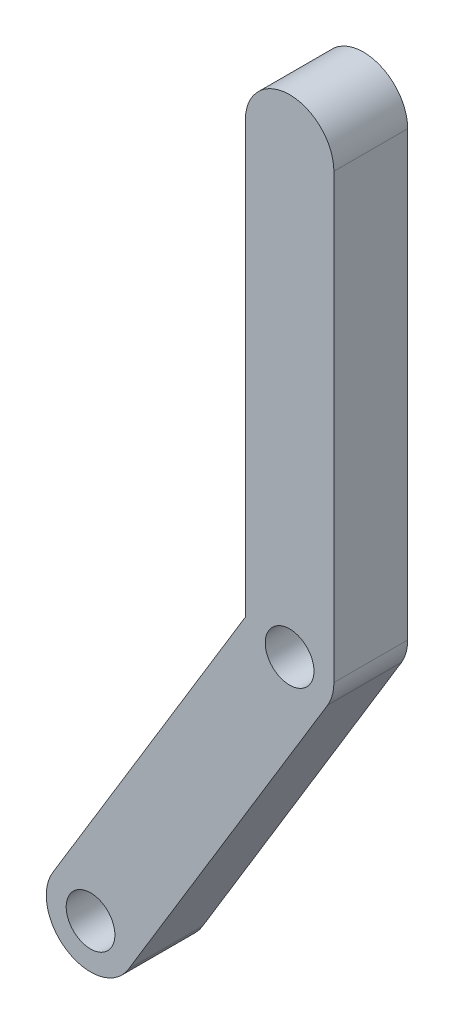
ISO-10303-21;
HEADER;
FILE_DESCRIPTION(('STEP AP214'),'2;1');
FILE_NAME('part.step','',(''),(''),'','','');
FILE_SCHEMA(('AUTOMOTIVE_DESIGN { 1 0 10303 214 1 1 1 1 }'));
ENDSEC;
DATA;
#1=APPLICATION_CONTEXT('core data for automotive mechanical design processes');
#2=APPLICATION_PROTOCOL_DEFINITION('international standard','automotive_design',2000,#1);
#3=PRODUCT_CONTEXT('',#1,'mechanical');
#4=PRODUCT('Part','Part','',(#3));
#5=PRODUCT_RELATED_PRODUCT_CATEGORY('part','',(#4));
#6=PRODUCT_DEFINITION_FORMATION('','',#4);
#7=PRODUCT_DEFINITION_CONTEXT('part definition',#1,'design');
#8=PRODUCT_DEFINITION('design','',#6,#7);
#9=PRODUCT_DEFINITION_SHAPE('','',#8);
#10=(LENGTH_UNIT() NAMED_UNIT(*) SI_UNIT(.MILLI.,.METRE.));
#11=(NAMED_UNIT(*) PLANE_ANGLE_UNIT() SI_UNIT($,.RADIAN.));
#12=(NAMED_UNIT(*) SI_UNIT($,.STERADIAN.) SOLID_ANGLE_UNIT());
#13=UNCERTAINTY_MEASURE_WITH_UNIT(LENGTH_MEASURE(1.E-05),#10,'distance_accuracy_value','');
#14=(GEOMETRIC_REPRESENTATION_CONTEXT(3) GLOBAL_UNCERTAINTY_ASSIGNED_CONTEXT((#13)) GLOBAL_UNIT_ASSIGNED_CONTEXT((#10,
#11,#12)) REPRESENTATION_CONTEXT('',''));
#15=CARTESIAN_POINT('',(0.,0.,0.));
#16=DIRECTION('',(0.,0.,1.));
#17=DIRECTION('',(1.,0.,0.));
#18=AXIS2_PLACEMENT_3D('',#15,#16,#17);
#19=CARTESIAN_POINT('',(2.56451588489692,-1.55618644079088,5.));
#20=DIRECTION('',(0.854911870672944,-0.518773258160525,0.));
#21=DIRECTION('',(0.518773258160525,0.854911870672944,0.));
#22=AXIS2_PLACEMENT_3D('',#19,#20,#21);
#23=PLANE('',#22);
#24=DIRECTION('',(-0.518773258160525,-0.854911870672944,0.));
#25=VECTOR('',#24,1.);
#26=CARTESIAN_POINT('',(2.56451588489692,-1.55618644079088,0.));
#27=LINE('',#26,#25);
#28=CARTESIAN_POINT('',(2.58488748132457,-1.52261508888212,0.));
#29=VERTEX_POINT('',#28);
#30=CARTESIAN_POINT('',(-10.9032172308491,-23.7503237263787,0.));
#31=VERTEX_POINT('',#30);
#32=EDGE_CURVE('E136',#29,#31,#27,.T.);
#33=ORIENTED_EDGE('',*,*,#32,.F.);
#34=DIRECTION('',(0.,0.,-1.));
#35=VECTOR('',#34,1.);
#36=CARTESIAN_POINT('',(2.58488748132457,-1.52261508888212,5.));
#37=LINE('',#36,#35);
#38=CARTESIAN_POINT('',(2.58488748132457,-1.52261508888212,5.));
#39=VERTEX_POINT('',#38);
#40=EDGE_CURVE('E11',#39,#29,#37,.T.);
#41=ORIENTED_EDGE('',*,*,#40,.F.);
#42=DIRECTION('',(-0.518773258160525,-0.854911870672944,0.));
#43=VECTOR('',#42,1.);
#44=CARTESIAN_POINT('',(2.56451588489692,-1.55618644079088,5.));
#45=LINE('',#44,#43);
#46=CARTESIAN_POINT('',(-10.9032172308491,-23.7503237263787,5.));
#47=VERTEX_POINT('',#46);
#48=EDGE_CURVE('E159',#39,#47,#45,.T.);
#49=ORIENTED_EDGE('',*,*,#48,.T.);
#50=DIRECTION('',(0.,0.,-1.));
#51=VECTOR('',#50,1.);
#52=CARTESIAN_POINT('',(-10.9032172308491,-23.7503237263787,5.));
#53=LINE('',#52,#51);
#54=EDGE_CURVE('E89',#47,#31,#53,.T.);
#55=ORIENTED_EDGE('',*,*,#54,.T.);
#56=EDGE_LOOP('',(#33,#41,#49,#55));
#57=FACE_BOUND('',#56,.T.);
#58=ADVANCED_FACE('F41',(#57),#23,.T.);
#59=CARTESIAN_POINT('',(0.,0.,5.));
#60=DIRECTION('',(0.,0.,-1.));
#61=DIRECTION('',(-1.,0.,0.));
#62=AXIS2_PLACEMENT_3D('',#59,#60,#61);
#63=CYLINDRICAL_SURFACE('',#62,3.);
#64=CARTESIAN_POINT('',(0.,0.,0.));
#65=DIRECTION('',(0.,0.,1.));
#66=DIRECTION('',(1.,0.,0.));
#67=AXIS2_PLACEMENT_3D('',#64,#65,#66);
#68=CIRCLE('',#67,3.);
#69=CARTESIAN_POINT('',(3.,0.,0.));
#70=VERTEX_POINT('',#69);
#71=EDGE_CURVE('E139',#29,#70,#68,.T.);
#72=ORIENTED_EDGE('',*,*,#71,.T.);
#73=DIRECTION('',(0.,0.,-1.));
#74=VECTOR('',#73,1.);
#75=CARTESIAN_POINT('',(3.,0.,5.));
#76=LINE('',#75,#74);
#77=CARTESIAN_POINT('',(3.,0.,5.));
#78=VERTEX_POINT('',#77);
#79=EDGE_CURVE('E49',#78,#70,#76,.T.);
#80=ORIENTED_EDGE('',*,*,#79,.F.);
#81=CARTESIAN_POINT('',(0.,0.,5.));
#82=DIRECTION('',(0.,0.,1.));
#83=DIRECTION('',(1.,0.,0.));
#84=AXIS2_PLACEMENT_3D('',#81,#82,#83);
#85=CIRCLE('',#84,3.);
#86=EDGE_CURVE('E179',#39,#78,#85,.T.);
#87=ORIENTED_EDGE('',*,*,#86,.F.);
#88=ORIENTED_EDGE('',*,*,#40,.T.);
#89=EDGE_LOOP('',(#72,#80,#87,#88));
#90=FACE_BOUND('',#89,.T.);
#91=ADVANCED_FACE('F172',(#90),#63,.T.);
#92=CARTESIAN_POINT('',(3.,0.,5.));
#93=DIRECTION('',(1.,0.,0.));
#94=DIRECTION('',(0.,1.,0.));
#95=AXIS2_PLACEMENT_3D('',#92,#93,#94);
#96=PLANE('',#95);
#97=DIRECTION('',(0.,-1.,0.));
#98=VECTOR('',#97,1.);
#99=CARTESIAN_POINT('',(3.,0.,0.));
#100=LINE('',#99,#98);
#101=CARTESIAN_POINT('',(3.,30.,0.));
#102=VERTEX_POINT('',#101);
#103=EDGE_CURVE('E144',#102,#70,#100,.T.);
#104=ORIENTED_EDGE('',*,*,#103,.F.);
#105=DIRECTION('',(0.,0.,-1.));
#106=VECTOR('',#105,1.);
#107=CARTESIAN_POINT('',(3.,30.,5.));
#108=LINE('',#107,#106);
#109=CARTESIAN_POINT('',(3.,30.,5.));
#110=VERTEX_POINT('',#109);
#111=EDGE_CURVE('E163',#110,#102,#108,.T.);
#112=ORIENTED_EDGE('',*,*,#111,.F.);
#113=DIRECTION('',(0.,-1.,0.));
#114=VECTOR('',#113,1.);
#115=CARTESIAN_POINT('',(3.,0.,5.));
#116=LINE('',#115,#114);
#117=EDGE_CURVE('E169',#110,#78,#116,.T.);
#118=ORIENTED_EDGE('',*,*,#117,.T.);
#119=ORIENTED_EDGE('',*,*,#79,.T.);
#120=EDGE_LOOP('',(#104,#112,#118,#119));
#121=FACE_BOUND('',#120,.T.);
#122=ADVANCED_FACE('F168',(#121),#96,.T.);
#123=CARTESIAN_POINT('',(0.,30.,5.));
#124=DIRECTION('',(0.,0.,-1.));
#125=DIRECTION('',(-1.,0.,0.));
#126=AXIS2_PLACEMENT_3D('',#123,#124,#125);
#127=CYLINDRICAL_SURFACE('',#126,3.);
#128=CARTESIAN_POINT('',(0.,30.,0.));
#129=DIRECTION('',(0.,0.,1.));
#130=DIRECTION('',(1.,0.,0.));
#131=AXIS2_PLACEMENT_3D('',#128,#129,#130);
#132=CIRCLE('',#131,3.);
#133=CARTESIAN_POINT('',(-3.,30.,0.));
#134=VERTEX_POINT('',#133);
#135=EDGE_CURVE('E147',#102,#134,#132,.T.);
#136=ORIENTED_EDGE('',*,*,#135,.T.);
#137=DIRECTION('',(0.,0.,-1.));
#138=VECTOR('',#137,1.);
#139=CARTESIAN_POINT('',(-3.,30.,5.));
#140=LINE('',#139,#138);
#141=CARTESIAN_POINT('',(-3.,30.,5.));
#142=VERTEX_POINT('',#141);
#143=EDGE_CURVE('E122',#142,#134,#140,.T.);
#144=ORIENTED_EDGE('',*,*,#143,.F.);
#145=CARTESIAN_POINT('',(0.,30.,5.));
#146=DIRECTION('',(0.,0.,1.));
#147=DIRECTION('',(1.,0.,0.));
#148=AXIS2_PLACEMENT_3D('',#145,#146,#147);
#149=CIRCLE('',#148,3.);
#150=EDGE_CURVE('E113',#110,#142,#149,.T.);
#151=ORIENTED_EDGE('',*,*,#150,.F.);
#152=ORIENTED_EDGE('',*,*,#111,.T.);
#153=EDGE_LOOP('',(#136,#144,#151,#152));
#154=FACE_BOUND('',#153,.T.);
#155=ADVANCED_FACE('F178',(#154),#127,.T.);
#156=CARTESIAN_POINT('',(-3.,0.,5.));
#157=DIRECTION('',(1.,0.,0.));
#158=DIRECTION('',(0.,1.,0.));
#159=AXIS2_PLACEMENT_3D('',#156,#157,#158);
#160=PLANE('',#159);
#161=DIRECTION('',(0.,-1.,0.));
#162=VECTOR('',#161,1.);
#163=CARTESIAN_POINT('',(-3.,0.,0.));
#164=LINE('',#163,#162);
#165=CARTESIAN_POINT('',(-3.,0.838530829915266,0.));
#166=VERTEX_POINT('',#165);
#167=EDGE_CURVE('E121',#134,#166,#164,.T.);
#168=ORIENTED_EDGE('',*,*,#167,.T.);
#169=DIRECTION('',(0.,0.,-1.));
#170=VECTOR('',#169,1.);
#171=CARTESIAN_POINT('',(-3.,0.838530829915266,5.));
#172=LINE('',#171,#170);
#173=CARTESIAN_POINT('',(-3.,0.838530829915266,5.));
#174=VERTEX_POINT('',#173);
#175=EDGE_CURVE('E118',#174,#166,#172,.T.);
#176=ORIENTED_EDGE('',*,*,#175,.F.);
#177=DIRECTION('',(0.,-1.,0.));
#178=VECTOR('',#177,1.);
#179=CARTESIAN_POINT('',(-3.,0.,5.));
#180=LINE('',#179,#178);
#181=EDGE_CURVE('E105',#142,#174,#180,.T.);
#182=ORIENTED_EDGE('',*,*,#181,.F.);
#183=ORIENTED_EDGE('',*,*,#143,.T.);
#184=EDGE_LOOP('',(#168,#176,#182,#183));
#185=FACE_BOUND('',#184,.T.);
#186=ADVANCED_FACE('F119',(#185),#160,.F.);
#187=CARTESIAN_POINT('',(-2.56451588489692,1.55618644079088,5.));
#188=DIRECTION('',(0.854911870672944,-0.518773258160526,0.));
#189=DIRECTION('',(0.518773258160526,0.854911870672944,0.));
#190=AXIS2_PLACEMENT_3D('',#187,#188,#189);
#191=PLANE('',#190);
#192=DIRECTION('',(-0.518773258160526,-0.854911870672944,0.));
#193=VECTOR('',#192,1.);
#194=CARTESIAN_POINT('',(-2.56451588489692,1.55618644079088,0.));
#195=LINE('',#194,#193);
#196=CARTESIAN_POINT('',(-16.0322490006429,-20.6379508447969,0.));
#197=VERTEX_POINT('',#196);
#198=EDGE_CURVE('E82',#166,#197,#195,.T.);
#199=ORIENTED_EDGE('',*,*,#198,.T.);
#200=DIRECTION('',(0.,0.,-1.));
#201=VECTOR('',#200,1.);
#202=CARTESIAN_POINT('',(-16.0322490006429,-20.6379508447969,5.));
#203=LINE('',#202,#201);
#204=CARTESIAN_POINT('',(-16.0322490006429,-20.6379508447969,5.));
#205=VERTEX_POINT('',#204);
#206=EDGE_CURVE('E123',#205,#197,#203,.T.);
#207=ORIENTED_EDGE('',*,*,#206,.F.);
#208=DIRECTION('',(-0.518773258160526,-0.854911870672944,0.));
#209=VECTOR('',#208,1.);
#210=CARTESIAN_POINT('',(-2.56451588489692,1.55618644079088,5.));
#211=LINE('',#210,#209);
#212=EDGE_CURVE('E110',#174,#205,#211,.T.);
#213=ORIENTED_EDGE('',*,*,#212,.F.);
#214=ORIENTED_EDGE('',*,*,#175,.T.);
#215=EDGE_LOOP('',(#199,#207,#213,#214));
#216=FACE_BOUND('',#215,.T.);
#217=ADVANCED_FACE('F125',(#216),#191,.F.);
#218=CARTESIAN_POINT('',(0.,0.,5.));
#219=DIRECTION('',(0.,0.,-1.));
#220=DIRECTION('',(-1.,0.,0.));
#221=AXIS2_PLACEMENT_3D('',#218,#219,#220);
#222=CYLINDRICAL_SURFACE('',#221,1.65);
#223=CARTESIAN_POINT('',(0.,0.,5.));
#224=DIRECTION('',(0.,0.,1.));
#225=DIRECTION('',(1.,0.,0.));
#226=AXIS2_PLACEMENT_3D('',#223,#224,#225);
#227=CIRCLE('',#226,1.65);
#228=CARTESIAN_POINT('',(1.65,0.,5.));
#229=VERTEX_POINT('',#228);
#230=EDGE_CURVE('E127',#229,#229,#227,.T.);
#231=ORIENTED_EDGE('',*,*,#230,.T.);
#232=EDGE_LOOP('',(#231));
#233=FACE_BOUND('',#232,.T.);
#234=CARTESIAN_POINT('',(0.,0.,0.));
#235=DIRECTION('',(0.,0.,1.));
#236=DIRECTION('',(1.,0.,0.));
#237=AXIS2_PLACEMENT_3D('',#234,#235,#236);
#238=CIRCLE('',#237,1.65);
#239=CARTESIAN_POINT('',(1.65,0.,0.));
#240=VERTEX_POINT('',#239);
#241=EDGE_CURVE('E153',#240,#240,#238,.T.);
#242=ORIENTED_EDGE('',*,*,#241,.F.);
#243=EDGE_LOOP('',(#242));
#244=FACE_BOUND('',#243,.T.);
#245=ADVANCED_FACE('F200',(#233,#244),#222,.F.);
#246=CARTESIAN_POINT('',(-13.4881047121737,-22.2277086374965,5.));
#247=DIRECTION('',(0.,0.,-1.));
#248=DIRECTION('',(-1.,0.,0.));
#249=AXIS2_PLACEMENT_3D('',#246,#247,#248);
#250=CYLINDRICAL_SURFACE('',#249,3.);
#251=CARTESIAN_POINT('',(-13.4881047121737,-22.2277086374965,0.));
#252=DIRECTION('',(0.,0.,1.));
#253=DIRECTION('',(1.,0.,0.));
#254=AXIS2_PLACEMENT_3D('',#251,#252,#253);
#255=CIRCLE('',#254,3.);
#256=EDGE_CURVE('E151',#197,#31,#255,.T.);
#257=ORIENTED_EDGE('',*,*,#256,.T.);
#258=ORIENTED_EDGE('',*,*,#54,.F.);
#259=CARTESIAN_POINT('',(-13.4881047121737,-22.2277086374965,5.));
#260=DIRECTION('',(0.,0.,1.));
#261=DIRECTION('',(1.,0.,0.));
#262=AXIS2_PLACEMENT_3D('',#259,#260,#261);
#263=CIRCLE('',#262,3.);
#264=EDGE_CURVE('E57',#205,#47,#263,.T.);
#265=ORIENTED_EDGE('',*,*,#264,.F.);
#266=ORIENTED_EDGE('',*,*,#206,.T.);
#267=EDGE_LOOP('',(#257,#258,#265,#266));
#268=FACE_BOUND('',#267,.T.);
#269=ADVANCED_FACE('F201',(#268),#250,.T.);
#270=CARTESIAN_POINT('',(-13.4881047121737,-22.2277086374965,5.));
#271=DIRECTION('',(0.,0.,-1.));
#272=DIRECTION('',(-1.,0.,0.));
#273=AXIS2_PLACEMENT_3D('',#270,#271,#272);
#274=CYLINDRICAL_SURFACE('',#273,1.65);
#275=CARTESIAN_POINT('',(-13.4881047121737,-22.2277086374965,5.));
#276=DIRECTION('',(0.,0.,1.));
#277=DIRECTION('',(1.,0.,0.));
#278=AXIS2_PLACEMENT_3D('',#275,#276,#277);
#279=CIRCLE('',#278,1.65);
#280=CARTESIAN_POINT('',(-11.8381047121737,-22.2277086374965,5.));
#281=VERTEX_POINT('',#280);
#282=EDGE_CURVE('E133',#281,#281,#279,.T.);
#283=ORIENTED_EDGE('',*,*,#282,.T.);
#284=EDGE_LOOP('',(#283));
#285=FACE_BOUND('',#284,.T.);
#286=CARTESIAN_POINT('',(-13.4881047121737,-22.2277086374965,0.));
#287=DIRECTION('',(0.,0.,1.));
#288=DIRECTION('',(1.,0.,0.));
#289=AXIS2_PLACEMENT_3D('',#286,#287,#288);
#290=CIRCLE('',#289,1.65);
#291=CARTESIAN_POINT('',(-11.8381047121737,-22.2277086374965,0.));
#292=VERTEX_POINT('',#291);
#293=EDGE_CURVE('E156',#292,#292,#290,.T.);
#294=ORIENTED_EDGE('',*,*,#293,.F.);
#295=EDGE_LOOP('',(#294));
#296=FACE_BOUND('',#295,.T.);
#297=ADVANCED_FACE('F204',(#285,#296),#274,.F.);
#298=CARTESIAN_POINT('',(0.,0.,5.));
#299=DIRECTION('',(0.,0.,1.));
#300=DIRECTION('',(1.,0.,0.));
#301=AXIS2_PLACEMENT_3D('',#298,#299,#300);
#302=PLANE('',#301);
#303=ORIENTED_EDGE('',*,*,#48,.F.);
#304=ORIENTED_EDGE('',*,*,#86,.T.);
#305=ORIENTED_EDGE('',*,*,#117,.F.);
#306=ORIENTED_EDGE('',*,*,#150,.T.);
#307=ORIENTED_EDGE('',*,*,#181,.T.);
#308=ORIENTED_EDGE('',*,*,#212,.T.);
#309=ORIENTED_EDGE('',*,*,#264,.T.);
#310=EDGE_LOOP('',(#303,#304,#305,#306,#307,#308,#309));
#311=FACE_BOUND('',#310,.T.);
#312=ORIENTED_EDGE('',*,*,#230,.F.);
#313=EDGE_LOOP('',(#312));
#314=FACE_BOUND('',#313,.T.);
#315=ORIENTED_EDGE('',*,*,#282,.F.);
#316=EDGE_LOOP('',(#315));
#317=FACE_BOUND('',#316,.T.);
#318=ADVANCED_FACE('F107',(#311,#314,#317),#302,.T.);
#319=CARTESIAN_POINT('',(0.,0.,0.));
#320=DIRECTION('',(0.,0.,1.));
#321=DIRECTION('',(1.,0.,0.));
#322=AXIS2_PLACEMENT_3D('',#319,#320,#321);
#323=PLANE('',#322);
#324=ORIENTED_EDGE('',*,*,#32,.T.);
#325=ORIENTED_EDGE('',*,*,#256,.F.);
#326=ORIENTED_EDGE('',*,*,#198,.F.);
#327=ORIENTED_EDGE('',*,*,#167,.F.);
#328=ORIENTED_EDGE('',*,*,#135,.F.);
#329=ORIENTED_EDGE('',*,*,#103,.T.);
#330=ORIENTED_EDGE('',*,*,#71,.F.);
#331=EDGE_LOOP('',(#324,#325,#326,#327,#328,#329,#330));
#332=FACE_BOUND('',#331,.T.);
#333=ORIENTED_EDGE('',*,*,#241,.T.);
#334=EDGE_LOOP('',(#333));
#335=FACE_BOUND('',#334,.T.);
#336=ORIENTED_EDGE('',*,*,#293,.T.);
#337=EDGE_LOOP('',(#336));
#338=FACE_BOUND('',#337,.T.);
#339=ADVANCED_FACE('F175',(#332,#335,#338),#323,.F.);
#340=CLOSED_SHELL('',(#58,#91,#122,#155,#186,#217,#245,#269,#297,#318,#339));
#341=MANIFOLD_SOLID_BREP('B2',#340);
#342=ADVANCED_BREP_SHAPE_REPRESENTATION('',(#18,#341),#14);
#343=SHAPE_DEFINITION_REPRESENTATION(#9,#342);
ENDSEC;
END-ISO-10303-21;
